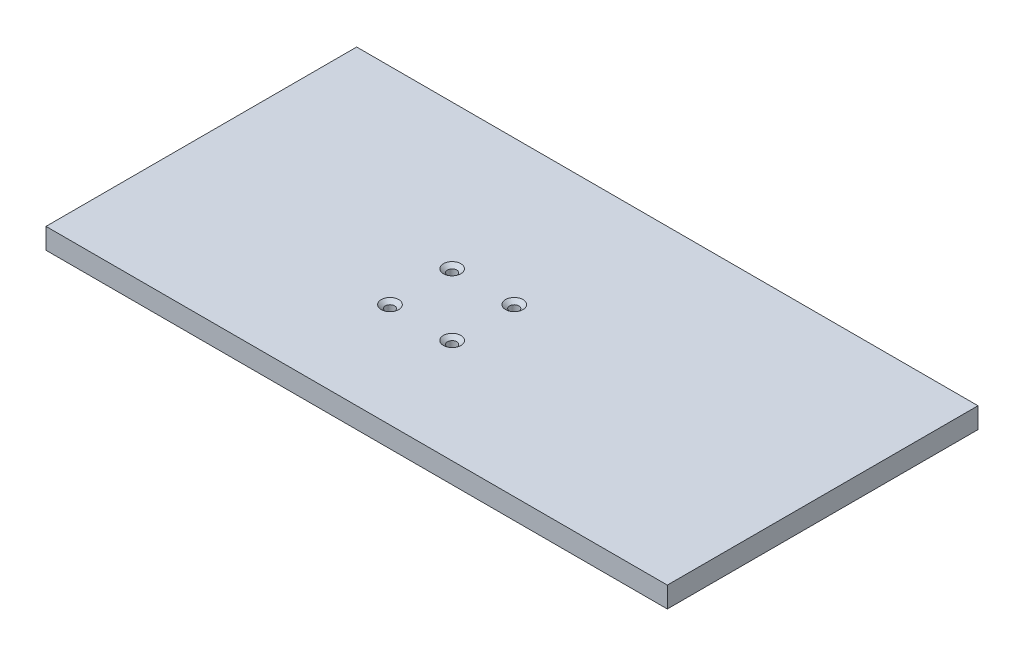
ISO-10303-21;
HEADER;
FILE_DESCRIPTION(('STEP AP214'),'2;1');
FILE_NAME('part.step','',(''),(''),'','','');
FILE_SCHEMA(('AUTOMOTIVE_DESIGN { 1 0 10303 214 1 1 1 1 }'));
ENDSEC;
DATA;
#1=APPLICATION_CONTEXT('core data for automotive mechanical design processes');
#2=APPLICATION_PROTOCOL_DEFINITION('international standard','automotive_design',2000,#1);
#3=PRODUCT_CONTEXT('',#1,'mechanical');
#4=PRODUCT('Part','Part','',(#3));
#5=PRODUCT_RELATED_PRODUCT_CATEGORY('part','',(#4));
#6=PRODUCT_DEFINITION_FORMATION('','',#4);
#7=PRODUCT_DEFINITION_CONTEXT('part definition',#1,'design');
#8=PRODUCT_DEFINITION('design','',#6,#7);
#9=PRODUCT_DEFINITION_SHAPE('','',#8);
#10=(LENGTH_UNIT() NAMED_UNIT(*) SI_UNIT(.MILLI.,.METRE.));
#11=(NAMED_UNIT(*) PLANE_ANGLE_UNIT() SI_UNIT($,.RADIAN.));
#12=(NAMED_UNIT(*) SI_UNIT($,.STERADIAN.) SOLID_ANGLE_UNIT());
#13=UNCERTAINTY_MEASURE_WITH_UNIT(LENGTH_MEASURE(1.E-05),#10,'distance_accuracy_value','');
#14=(GEOMETRIC_REPRESENTATION_CONTEXT(3) GLOBAL_UNCERTAINTY_ASSIGNED_CONTEXT((#13)) GLOBAL_UNIT_ASSIGNED_CONTEXT((#10,
#11,#12)) REPRESENTATION_CONTEXT('',''));
#15=CARTESIAN_POINT('',(0.,0.,0.));
#16=DIRECTION('',(0.,0.,1.));
#17=DIRECTION('',(1.,0.,0.));
#18=AXIS2_PLACEMENT_3D('',#15,#16,#17);
#19=CARTESIAN_POINT('',(-150.,10.,75.));
#20=DIRECTION('',(1.,0.,0.));
#21=DIRECTION('',(0.,0.,-1.));
#22=AXIS2_PLACEMENT_3D('',#19,#20,#21);
#23=PLANE('',#22);
#24=DIRECTION('',(0.,0.,1.));
#25=VECTOR('',#24,1.);
#26=CARTESIAN_POINT('',(-150.,0.,75.));
#27=LINE('',#26,#25);
#28=CARTESIAN_POINT('',(-150.,0.,-75.));
#29=VERTEX_POINT('',#28);
#30=CARTESIAN_POINT('',(-150.,0.,75.));
#31=VERTEX_POINT('',#30);
#32=EDGE_CURVE('E96',#29,#31,#27,.T.);
#33=ORIENTED_EDGE('',*,*,#32,.T.);
#34=DIRECTION('',(0.,-1.,0.));
#35=VECTOR('',#34,1.);
#36=CARTESIAN_POINT('',(-150.,10.,75.));
#37=LINE('',#36,#35);
#38=CARTESIAN_POINT('',(-150.,10.,75.));
#39=VERTEX_POINT('',#38);
#40=EDGE_CURVE('E11',#39,#31,#37,.T.);
#41=ORIENTED_EDGE('',*,*,#40,.F.);
#42=DIRECTION('',(0.,0.,1.));
#43=VECTOR('',#42,1.);
#44=CARTESIAN_POINT('',(-150.,10.,75.));
#45=LINE('',#44,#43);
#46=CARTESIAN_POINT('',(-150.,10.,-75.));
#47=VERTEX_POINT('',#46);
#48=EDGE_CURVE('E84',#47,#39,#45,.T.);
#49=ORIENTED_EDGE('',*,*,#48,.F.);
#50=DIRECTION('',(0.,-1.,0.));
#51=VECTOR('',#50,1.);
#52=CARTESIAN_POINT('',(-150.,10.,-75.));
#53=LINE('',#52,#51);
#54=EDGE_CURVE('E92',#47,#29,#53,.T.);
#55=ORIENTED_EDGE('',*,*,#54,.T.);
#56=EDGE_LOOP('',(#33,#41,#49,#55));
#57=FACE_BOUND('',#56,.T.);
#58=ADVANCED_FACE('F33',(#57),#23,.F.);
#59=CARTESIAN_POINT('',(150.,10.,75.));
#60=DIRECTION('',(0.,0.,-1.));
#61=DIRECTION('',(-1.,0.,0.));
#62=AXIS2_PLACEMENT_3D('',#59,#60,#61);
#63=PLANE('',#62);
#64=DIRECTION('',(1.,0.,0.));
#65=VECTOR('',#64,1.);
#66=CARTESIAN_POINT('',(150.,0.,75.));
#67=LINE('',#66,#65);
#68=CARTESIAN_POINT('',(150.,0.,75.));
#69=VERTEX_POINT('',#68);
#70=EDGE_CURVE('E88',#31,#69,#67,.T.);
#71=ORIENTED_EDGE('',*,*,#70,.T.);
#72=DIRECTION('',(0.,-1.,0.));
#73=VECTOR('',#72,1.);
#74=CARTESIAN_POINT('',(150.,10.,75.));
#75=LINE('',#74,#73);
#76=CARTESIAN_POINT('',(150.,10.,75.));
#77=VERTEX_POINT('',#76);
#78=EDGE_CURVE('E41',#77,#69,#75,.T.);
#79=ORIENTED_EDGE('',*,*,#78,.F.);
#80=DIRECTION('',(1.,0.,0.));
#81=VECTOR('',#80,1.);
#82=CARTESIAN_POINT('',(150.,10.,75.));
#83=LINE('',#82,#81);
#84=EDGE_CURVE('E79',#39,#77,#83,.T.);
#85=ORIENTED_EDGE('',*,*,#84,.F.);
#86=ORIENTED_EDGE('',*,*,#40,.T.);
#87=EDGE_LOOP('',(#71,#79,#85,#86));
#88=FACE_BOUND('',#87,.T.);
#89=ADVANCED_FACE('F87',(#88),#63,.F.);
#90=CARTESIAN_POINT('',(150.,10.,75.));
#91=DIRECTION('',(-1.,0.,0.));
#92=DIRECTION('',(0.,0.,1.));
#93=AXIS2_PLACEMENT_3D('',#90,#91,#92);
#94=PLANE('',#93);
#95=DIRECTION('',(0.,0.,-1.));
#96=VECTOR('',#95,1.);
#97=CARTESIAN_POINT('',(150.,0.,75.));
#98=LINE('',#97,#96);
#99=CARTESIAN_POINT('',(150.,0.,-75.));
#100=VERTEX_POINT('',#99);
#101=EDGE_CURVE('E66',#69,#100,#98,.T.);
#102=ORIENTED_EDGE('',*,*,#101,.T.);
#103=DIRECTION('',(0.,-1.,0.));
#104=VECTOR('',#103,1.);
#105=CARTESIAN_POINT('',(150.,10.,-75.));
#106=LINE('',#105,#104);
#107=CARTESIAN_POINT('',(150.,10.,-75.));
#108=VERTEX_POINT('',#107);
#109=EDGE_CURVE('E89',#108,#100,#106,.T.);
#110=ORIENTED_EDGE('',*,*,#109,.F.);
#111=DIRECTION('',(0.,0.,-1.));
#112=VECTOR('',#111,1.);
#113=CARTESIAN_POINT('',(150.,10.,75.));
#114=LINE('',#113,#112);
#115=EDGE_CURVE('E82',#77,#108,#114,.T.);
#116=ORIENTED_EDGE('',*,*,#115,.F.);
#117=ORIENTED_EDGE('',*,*,#78,.T.);
#118=EDGE_LOOP('',(#102,#110,#116,#117));
#119=FACE_BOUND('',#118,.T.);
#120=ADVANCED_FACE('F90',(#119),#94,.F.);
#121=CARTESIAN_POINT('',(150.,10.,-75.));
#122=DIRECTION('',(0.,0.,1.));
#123=DIRECTION('',(1.,0.,0.));
#124=AXIS2_PLACEMENT_3D('',#121,#122,#123);
#125=PLANE('',#124);
#126=DIRECTION('',(-1.,0.,0.));
#127=VECTOR('',#126,1.);
#128=CARTESIAN_POINT('',(150.,0.,-75.));
#129=LINE('',#128,#127);
#130=EDGE_CURVE('E72',#100,#29,#129,.T.);
#131=ORIENTED_EDGE('',*,*,#130,.T.);
#132=ORIENTED_EDGE('',*,*,#54,.F.);
#133=DIRECTION('',(-1.,0.,0.));
#134=VECTOR('',#133,1.);
#135=CARTESIAN_POINT('',(150.,10.,-75.));
#136=LINE('',#135,#134);
#137=EDGE_CURVE('E49',#108,#47,#136,.T.);
#138=ORIENTED_EDGE('',*,*,#137,.F.);
#139=ORIENTED_EDGE('',*,*,#109,.T.);
#140=EDGE_LOOP('',(#131,#132,#138,#139));
#141=FACE_BOUND('',#140,.T.);
#142=ADVANCED_FACE('F104',(#141),#125,.F.);
#143=CARTESIAN_POINT('',(0.,10.,0.));
#144=DIRECTION('',(0.,1.,0.));
#145=DIRECTION('',(0.,0.,1.));
#146=AXIS2_PLACEMENT_3D('',#143,#144,#145);
#147=PLANE('',#146);
#148=CARTESIAN_POINT('',(-4.24422419309506,10.,-5.33507095217171));
#149=DIRECTION('',(0.,1.,0.));
#150=DIRECTION('',(0.,0.,1.));
#151=AXIS2_PLACEMENT_3D('',#148,#149,#150);
#152=CIRCLE('',#151,4.2164);
#153=CARTESIAN_POINT('',(-4.24422419309506,10.,-1.11867095217171));
#154=VERTEX_POINT('',#153);
#155=EDGE_CURVE('E142',#154,#154,#152,.T.);
#156=ORIENTED_EDGE('',*,*,#155,.F.);
#157=EDGE_LOOP('',(#156));
#158=FACE_BOUND('',#157,.T.);
#159=CARTESIAN_POINT('',(-4.24422419309475,10.,24.6649290478283));
#160=DIRECTION('',(0.,1.,0.));
#161=DIRECTION('',(0.,0.,1.));
#162=AXIS2_PLACEMENT_3D('',#159,#160,#161);
#163=CIRCLE('',#162,4.2164);
#164=CARTESIAN_POINT('',(-4.24422419309475,10.,28.8813290478283));
#165=VERTEX_POINT('',#164);
#166=EDGE_CURVE('E133',#165,#165,#163,.T.);
#167=ORIENTED_EDGE('',*,*,#166,.F.);
#168=EDGE_LOOP('',(#167));
#169=FACE_BOUND('',#168,.T.);
#170=CARTESIAN_POINT('',(-34.2442241930947,10.,24.6649290478283));
#171=DIRECTION('',(0.,1.,0.));
#172=DIRECTION('',(0.,0.,1.));
#173=AXIS2_PLACEMENT_3D('',#170,#171,#172);
#174=CIRCLE('',#173,4.2164);
#175=CARTESIAN_POINT('',(-34.2442241930947,10.,28.8813290478283));
#176=VERTEX_POINT('',#175);
#177=EDGE_CURVE('E124',#176,#176,#174,.T.);
#178=ORIENTED_EDGE('',*,*,#177,.F.);
#179=EDGE_LOOP('',(#178));
#180=FACE_BOUND('',#179,.T.);
#181=CARTESIAN_POINT('',(-34.2442241930951,10.,-5.33507095217171));
#182=DIRECTION('',(0.,1.,0.));
#183=DIRECTION('',(0.,0.,1.));
#184=AXIS2_PLACEMENT_3D('',#181,#182,#183);
#185=CIRCLE('',#184,4.2164);
#186=CARTESIAN_POINT('',(-34.2442241930951,10.,-1.1186709521717));
#187=VERTEX_POINT('',#186);
#188=EDGE_CURVE('E115',#187,#187,#185,.T.);
#189=ORIENTED_EDGE('',*,*,#188,.F.);
#190=EDGE_LOOP('',(#189));
#191=FACE_BOUND('',#190,.T.);
#192=ORIENTED_EDGE('',*,*,#48,.T.);
#193=ORIENTED_EDGE('',*,*,#84,.T.);
#194=ORIENTED_EDGE('',*,*,#115,.T.);
#195=ORIENTED_EDGE('',*,*,#137,.T.);
#196=EDGE_LOOP('',(#192,#193,#194,#195));
#197=FACE_BOUND('',#196,.T.);
#198=ADVANCED_FACE('F80',(#158,#169,#180,#191,#197),#147,.T.);
#199=CARTESIAN_POINT('',(0.,0.,0.));
#200=DIRECTION('',(0.,1.,0.));
#201=DIRECTION('',(0.,0.,1.));
#202=AXIS2_PLACEMENT_3D('',#199,#200,#201);
#203=PLANE('',#202);
#204=CARTESIAN_POINT('',(-4.24422419309506,0.,-5.33507095217171));
#205=DIRECTION('',(0.,1.,0.));
#206=DIRECTION('',(0.,0.,1.));
#207=AXIS2_PLACEMENT_3D('',#204,#205,#206);
#208=CIRCLE('',#207,2.2479);
#209=CARTESIAN_POINT('',(-4.24422419309506,0.,-3.08717095217171));
#210=VERTEX_POINT('',#209);
#211=EDGE_CURVE('E136',#210,#210,#208,.T.);
#212=ORIENTED_EDGE('',*,*,#211,.T.);
#213=EDGE_LOOP('',(#212));
#214=FACE_BOUND('',#213,.T.);
#215=CARTESIAN_POINT('',(-4.24422419309475,0.,24.6649290478283));
#216=DIRECTION('',(0.,1.,0.));
#217=DIRECTION('',(0.,0.,1.));
#218=AXIS2_PLACEMENT_3D('',#215,#216,#217);
#219=CIRCLE('',#218,2.2479);
#220=CARTESIAN_POINT('',(-4.24422419309475,0.,26.9128290478283));
#221=VERTEX_POINT('',#220);
#222=EDGE_CURVE('E127',#221,#221,#219,.T.);
#223=ORIENTED_EDGE('',*,*,#222,.T.);
#224=EDGE_LOOP('',(#223));
#225=FACE_BOUND('',#224,.T.);
#226=CARTESIAN_POINT('',(-34.2442241930947,0.,24.6649290478283));
#227=DIRECTION('',(0.,1.,0.));
#228=DIRECTION('',(0.,0.,1.));
#229=AXIS2_PLACEMENT_3D('',#226,#227,#228);
#230=CIRCLE('',#229,2.2479);
#231=CARTESIAN_POINT('',(-34.2442241930947,0.,26.9128290478283));
#232=VERTEX_POINT('',#231);
#233=EDGE_CURVE('E118',#232,#232,#230,.T.);
#234=ORIENTED_EDGE('',*,*,#233,.T.);
#235=EDGE_LOOP('',(#234));
#236=FACE_BOUND('',#235,.T.);
#237=CARTESIAN_POINT('',(-34.2442241930951,0.,-5.33507095217171));
#238=DIRECTION('',(0.,1.,0.));
#239=DIRECTION('',(0.,0.,1.));
#240=AXIS2_PLACEMENT_3D('',#237,#238,#239);
#241=CIRCLE('',#240,2.2479);
#242=CARTESIAN_POINT('',(-34.2442241930951,0.,-3.08717095217171));
#243=VERTEX_POINT('',#242);
#244=EDGE_CURVE('E99',#243,#243,#241,.T.);
#245=ORIENTED_EDGE('',*,*,#244,.T.);
#246=EDGE_LOOP('',(#245));
#247=FACE_BOUND('',#246,.T.);
#248=ORIENTED_EDGE('',*,*,#32,.F.);
#249=ORIENTED_EDGE('',*,*,#130,.F.);
#250=ORIENTED_EDGE('',*,*,#101,.F.);
#251=ORIENTED_EDGE('',*,*,#70,.F.);
#252=EDGE_LOOP('',(#248,#249,#250,#251));
#253=FACE_BOUND('',#252,.T.);
#254=ADVANCED_FACE('F107',(#214,#225,#236,#247,#253),#203,.F.);
#255=CARTESIAN_POINT('',(-34.2442241930951,10.,-5.33507095217171));
#256=DIRECTION('',(0.,1.,0.));
#257=DIRECTION('',(0.,0.,1.));
#258=AXIS2_PLACEMENT_3D('',#255,#256,#257);
#259=CYLINDRICAL_SURFACE('',#258,2.2479);
#260=ORIENTED_EDGE('',*,*,#244,.F.);
#261=EDGE_LOOP('',(#260));
#262=FACE_BOUND('',#261,.T.);
#263=CARTESIAN_POINT('',(-34.2442241930951,8.34823237602752,-5.33507095217171));
#264=DIRECTION('',(0.,1.,0.));
#265=DIRECTION('',(0.,0.,1.));
#266=AXIS2_PLACEMENT_3D('',#263,#264,#265);
#267=CIRCLE('',#266,2.2479);
#268=CARTESIAN_POINT('',(-34.2442241930951,8.34823237602752,-3.08717095217171));
#269=VERTEX_POINT('',#268);
#270=EDGE_CURVE('E112',#269,#269,#267,.T.);
#271=ORIENTED_EDGE('',*,*,#270,.T.);
#272=EDGE_LOOP('',(#271));
#273=FACE_BOUND('',#272,.T.);
#274=ADVANCED_FACE('F160',(#262,#273),#259,.F.);
#275=CARTESIAN_POINT('',(-34.2442241930951,10.,-5.33507095217171));
#276=DIRECTION('',(0.,1.,0.));
#277=DIRECTION('',(0.,0.,1.));
#278=AXIS2_PLACEMENT_3D('',#275,#276,#277);
#279=CONICAL_SURFACE('',#278,4.2164,0.872664625997165);
#280=ORIENTED_EDGE('',*,*,#270,.F.);
#281=EDGE_LOOP('',(#280));
#282=FACE_BOUND('',#281,.T.);
#283=ORIENTED_EDGE('',*,*,#188,.T.);
#284=EDGE_LOOP('',(#283));
#285=FACE_BOUND('',#284,.T.);
#286=ADVANCED_FACE('F157',(#282,#285),#279,.F.);
#287=CARTESIAN_POINT('',(-34.2442241930947,10.,24.6649290478283));
#288=DIRECTION('',(0.,1.,0.));
#289=DIRECTION('',(0.,0.,1.));
#290=AXIS2_PLACEMENT_3D('',#287,#288,#289);
#291=CYLINDRICAL_SURFACE('',#290,2.2479);
#292=ORIENTED_EDGE('',*,*,#233,.F.);
#293=EDGE_LOOP('',(#292));
#294=FACE_BOUND('',#293,.T.);
#295=CARTESIAN_POINT('',(-34.2442241930947,8.34823237602752,24.6649290478283));
#296=DIRECTION('',(0.,1.,0.));
#297=DIRECTION('',(0.,0.,1.));
#298=AXIS2_PLACEMENT_3D('',#295,#296,#297);
#299=CIRCLE('',#298,2.2479);
#300=CARTESIAN_POINT('',(-34.2442241930947,8.34823237602752,26.9128290478283));
#301=VERTEX_POINT('',#300);
#302=EDGE_CURVE('E121',#301,#301,#299,.T.);
#303=ORIENTED_EDGE('',*,*,#302,.T.);
#304=EDGE_LOOP('',(#303));
#305=FACE_BOUND('',#304,.T.);
#306=ADVANCED_FACE('F159',(#294,#305),#291,.F.);
#307=CARTESIAN_POINT('',(-34.2442241930947,10.,24.6649290478283));
#308=DIRECTION('',(0.,1.,0.));
#309=DIRECTION('',(0.,0.,1.));
#310=AXIS2_PLACEMENT_3D('',#307,#308,#309);
#311=CONICAL_SURFACE('',#310,4.2164,0.872664625997165);
#312=ORIENTED_EDGE('',*,*,#302,.F.);
#313=EDGE_LOOP('',(#312));
#314=FACE_BOUND('',#313,.T.);
#315=ORIENTED_EDGE('',*,*,#177,.T.);
#316=EDGE_LOOP('',(#315));
#317=FACE_BOUND('',#316,.T.);
#318=ADVANCED_FACE('F167',(#314,#317),#311,.F.);
#319=CARTESIAN_POINT('',(-4.24422419309475,10.,24.6649290478283));
#320=DIRECTION('',(0.,1.,0.));
#321=DIRECTION('',(0.,0.,1.));
#322=AXIS2_PLACEMENT_3D('',#319,#320,#321);
#323=CYLINDRICAL_SURFACE('',#322,2.2479);
#324=ORIENTED_EDGE('',*,*,#222,.F.);
#325=EDGE_LOOP('',(#324));
#326=FACE_BOUND('',#325,.T.);
#327=CARTESIAN_POINT('',(-4.24422419309475,8.34823237602752,24.6649290478283));
#328=DIRECTION('',(0.,1.,0.));
#329=DIRECTION('',(0.,0.,1.));
#330=AXIS2_PLACEMENT_3D('',#327,#328,#329);
#331=CIRCLE('',#330,2.2479);
#332=CARTESIAN_POINT('',(-4.24422419309475,8.34823237602752,26.9128290478283));
#333=VERTEX_POINT('',#332);
#334=EDGE_CURVE('E130',#333,#333,#331,.T.);
#335=ORIENTED_EDGE('',*,*,#334,.T.);
#336=EDGE_LOOP('',(#335));
#337=FACE_BOUND('',#336,.T.);
#338=ADVANCED_FACE('F202',(#326,#337),#323,.F.);
#339=CARTESIAN_POINT('',(-4.24422419309475,10.,24.6649290478283));
#340=DIRECTION('',(0.,1.,0.));
#341=DIRECTION('',(0.,0.,1.));
#342=AXIS2_PLACEMENT_3D('',#339,#340,#341);
#343=CONICAL_SURFACE('',#342,4.2164,0.872664625997165);
#344=ORIENTED_EDGE('',*,*,#334,.F.);
#345=EDGE_LOOP('',(#344));
#346=FACE_BOUND('',#345,.T.);
#347=ORIENTED_EDGE('',*,*,#166,.T.);
#348=EDGE_LOOP('',(#347));
#349=FACE_BOUND('',#348,.T.);
#350=ADVANCED_FACE('F207',(#346,#349),#343,.F.);
#351=CARTESIAN_POINT('',(-4.24422419309506,10.,-5.33507095217171));
#352=DIRECTION('',(0.,1.,0.));
#353=DIRECTION('',(0.,0.,1.));
#354=AXIS2_PLACEMENT_3D('',#351,#352,#353);
#355=CYLINDRICAL_SURFACE('',#354,2.2479);
#356=ORIENTED_EDGE('',*,*,#211,.F.);
#357=EDGE_LOOP('',(#356));
#358=FACE_BOUND('',#357,.T.);
#359=CARTESIAN_POINT('',(-4.24422419309506,8.34823237602752,-5.33507095217171));
#360=DIRECTION('',(0.,1.,0.));
#361=DIRECTION('',(0.,0.,1.));
#362=AXIS2_PLACEMENT_3D('',#359,#360,#361);
#363=CIRCLE('',#362,2.2479);
#364=CARTESIAN_POINT('',(-4.24422419309506,8.34823237602752,-3.08717095217171));
#365=VERTEX_POINT('',#364);
#366=EDGE_CURVE('E139',#365,#365,#363,.T.);
#367=ORIENTED_EDGE('',*,*,#366,.T.);
#368=EDGE_LOOP('',(#367));
#369=FACE_BOUND('',#368,.T.);
#370=ADVANCED_FACE('F213',(#358,#369),#355,.F.);
#371=CARTESIAN_POINT('',(-4.24422419309506,10.,-5.33507095217171));
#372=DIRECTION('',(0.,1.,0.));
#373=DIRECTION('',(0.,0.,1.));
#374=AXIS2_PLACEMENT_3D('',#371,#372,#373);
#375=CONICAL_SURFACE('',#374,4.2164,0.872664625997165);
#376=ORIENTED_EDGE('',*,*,#366,.F.);
#377=EDGE_LOOP('',(#376));
#378=FACE_BOUND('',#377,.T.);
#379=ORIENTED_EDGE('',*,*,#155,.T.);
#380=EDGE_LOOP('',(#379));
#381=FACE_BOUND('',#380,.T.);
#382=ADVANCED_FACE('F146',(#378,#381),#375,.F.);
#383=CLOSED_SHELL('',(#58,#89,#120,#142,#198,#254,#274,#286,#306,#318,#338,#350,#370,#382));
#384=MANIFOLD_SOLID_BREP('B2',#383);
#385=ADVANCED_BREP_SHAPE_REPRESENTATION('',(#18,#384),#14);
#386=SHAPE_DEFINITION_REPRESENTATION(#9,#385);
ENDSEC;
END-ISO-10303-21;
